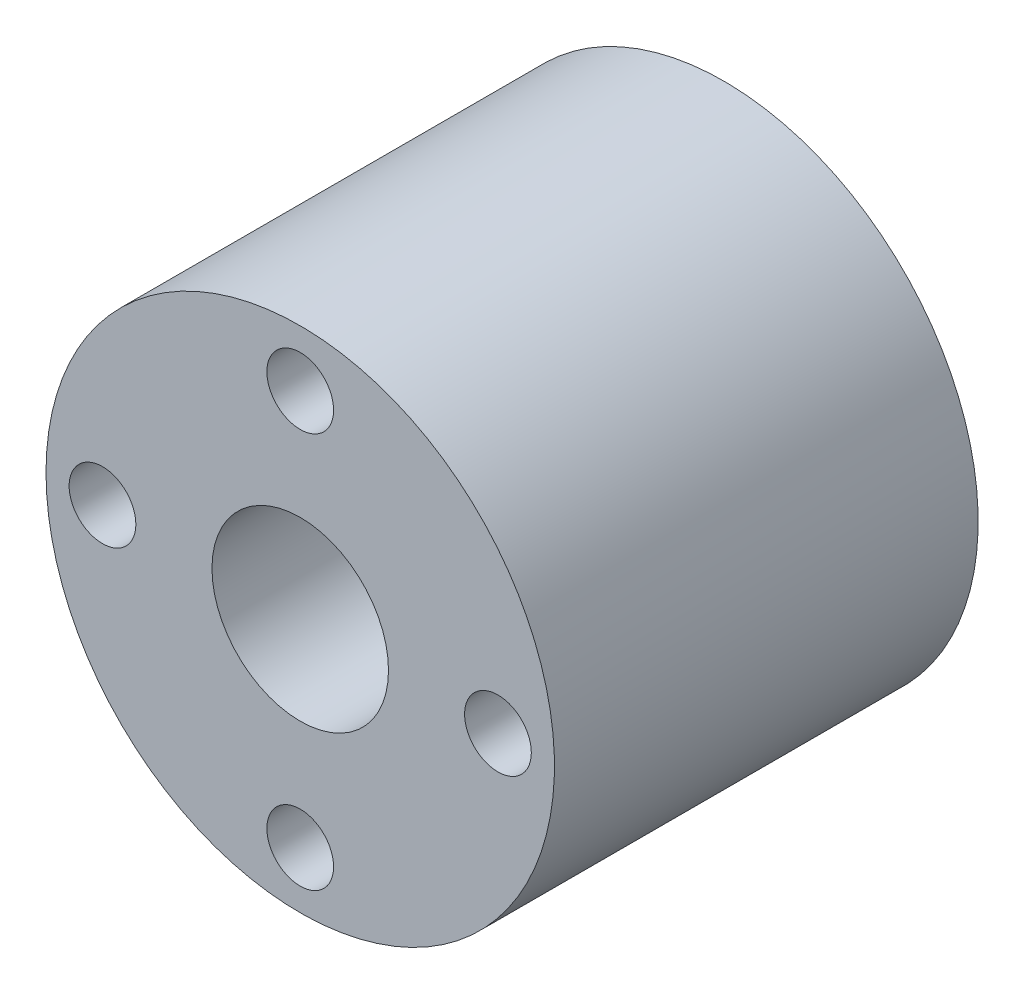
ISO-10303-21;
HEADER;
FILE_DESCRIPTION(('STEP AP214'),'2;1');
FILE_NAME('part.step','',(''),(''),'','','');
FILE_SCHEMA(('AUTOMOTIVE_DESIGN { 1 0 10303 214 1 1 1 1 }'));
ENDSEC;
DATA;
#1=APPLICATION_CONTEXT('core data for automotive mechanical design processes');
#2=APPLICATION_PROTOCOL_DEFINITION('international standard','automotive_design',2000,#1);
#3=PRODUCT_CONTEXT('',#1,'mechanical');
#4=PRODUCT('Part','Part','',(#3));
#5=PRODUCT_RELATED_PRODUCT_CATEGORY('part','',(#4));
#6=PRODUCT_DEFINITION_FORMATION('','',#4);
#7=PRODUCT_DEFINITION_CONTEXT('part definition',#1,'design');
#8=PRODUCT_DEFINITION('design','',#6,#7);
#9=PRODUCT_DEFINITION_SHAPE('','',#8);
#10=(LENGTH_UNIT() NAMED_UNIT(*) SI_UNIT(.MILLI.,.METRE.));
#11=(NAMED_UNIT(*) PLANE_ANGLE_UNIT() SI_UNIT($,.RADIAN.));
#12=(NAMED_UNIT(*) SI_UNIT($,.STERADIAN.) SOLID_ANGLE_UNIT());
#13=UNCERTAINTY_MEASURE_WITH_UNIT(LENGTH_MEASURE(1.E-05),#10,'distance_accuracy_value','');
#14=(GEOMETRIC_REPRESENTATION_CONTEXT(3) GLOBAL_UNCERTAINTY_ASSIGNED_CONTEXT((#13)) GLOBAL_UNIT_ASSIGNED_CONTEXT((#10,
#11,#12)) REPRESENTATION_CONTEXT('',''));
#15=CARTESIAN_POINT('',(0.,0.,0.));
#16=DIRECTION('',(0.,0.,1.));
#17=DIRECTION('',(1.,0.,0.));
#18=AXIS2_PLACEMENT_3D('',#15,#16,#17);
#19=CARTESIAN_POINT('',(0.,0.,19.05));
#20=DIRECTION('',(0.,0.,1.));
#21=DIRECTION('',(1.,0.,0.));
#22=AXIS2_PLACEMENT_3D('',#19,#20,#21);
#23=PLANE('',#22);
#24=CARTESIAN_POINT('',(8.89,0.,19.05));
#25=DIRECTION('',(0.,0.,1.));
#26=DIRECTION('',(1.,0.,0.));
#27=AXIS2_PLACEMENT_3D('',#24,#25,#26);
#28=CIRCLE('',#27,1.5);
#29=CARTESIAN_POINT('',(10.39,0.,19.05));
#30=VERTEX_POINT('',#29);
#31=EDGE_CURVE('E76',#30,#30,#28,.T.);
#32=ORIENTED_EDGE('',*,*,#31,.F.);
#33=EDGE_LOOP('',(#32));
#34=FACE_BOUND('',#33,.T.);
#35=CARTESIAN_POINT('',(0.,-8.89,19.05));
#36=DIRECTION('',(0.,0.,1.));
#37=DIRECTION('',(1.,0.,0.));
#38=AXIS2_PLACEMENT_3D('',#35,#36,#37);
#39=CIRCLE('',#38,1.5);
#40=CARTESIAN_POINT('',(1.5,-8.89,19.05));
#41=VERTEX_POINT('',#40);
#42=EDGE_CURVE('E70',#41,#41,#39,.T.);
#43=ORIENTED_EDGE('',*,*,#42,.F.);
#44=EDGE_LOOP('',(#43));
#45=FACE_BOUND('',#44,.T.);
#46=CARTESIAN_POINT('',(-8.89,0.,19.05));
#47=DIRECTION('',(0.,0.,1.));
#48=DIRECTION('',(1.,0.,0.));
#49=AXIS2_PLACEMENT_3D('',#46,#47,#48);
#50=CIRCLE('',#49,1.5);
#51=CARTESIAN_POINT('',(-7.39,0.,19.05));
#52=VERTEX_POINT('',#51);
#53=EDGE_CURVE('E64',#52,#52,#50,.T.);
#54=ORIENTED_EDGE('',*,*,#53,.F.);
#55=EDGE_LOOP('',(#54));
#56=FACE_BOUND('',#55,.T.);
#57=CARTESIAN_POINT('',(0.,8.89,19.05));
#58=DIRECTION('',(0.,0.,1.));
#59=DIRECTION('',(1.,0.,0.));
#60=AXIS2_PLACEMENT_3D('',#57,#58,#59);
#61=CIRCLE('',#60,1.5);
#62=CARTESIAN_POINT('',(1.5,8.89,19.05));
#63=VERTEX_POINT('',#62);
#64=EDGE_CURVE('E58',#63,#63,#61,.T.);
#65=ORIENTED_EDGE('',*,*,#64,.F.);
#66=EDGE_LOOP('',(#65));
#67=FACE_BOUND('',#66,.T.);
#68=CARTESIAN_POINT('',(0.,0.,19.05));
#69=DIRECTION('',(0.,0.,1.));
#70=DIRECTION('',(1.,0.,0.));
#71=AXIS2_PLACEMENT_3D('',#68,#69,#70);
#72=CIRCLE('',#71,11.43);
#73=CARTESIAN_POINT('',(-11.43,0.,19.05));
#74=VERTEX_POINT('',#73);
#75=EDGE_CURVE('E10',#74,#74,#72,.T.);
#76=ORIENTED_EDGE('',*,*,#75,.T.);
#77=EDGE_LOOP('',(#76));
#78=FACE_BOUND('',#77,.T.);
#79=CARTESIAN_POINT('',(0.,0.,19.05));
#80=DIRECTION('',(0.,0.,1.));
#81=DIRECTION('',(1.,0.,0.));
#82=AXIS2_PLACEMENT_3D('',#79,#80,#81);
#83=CIRCLE('',#82,3.96875);
#84=CARTESIAN_POINT('',(-3.96875,0.,19.05));
#85=VERTEX_POINT('',#84);
#86=EDGE_CURVE('E48',#85,#85,#83,.T.);
#87=ORIENTED_EDGE('',*,*,#86,.F.);
#88=EDGE_LOOP('',(#87));
#89=FACE_BOUND('',#88,.T.);
#90=ADVANCED_FACE('F37',(#34,#45,#56,#67,#78,#89),#23,.T.);
#91=CARTESIAN_POINT('',(0.,0.,0.));
#92=DIRECTION('',(0.,0.,1.));
#93=DIRECTION('',(1.,0.,0.));
#94=AXIS2_PLACEMENT_3D('',#91,#92,#93);
#95=PLANE('',#94);
#96=CARTESIAN_POINT('',(8.89,0.,0.));
#97=DIRECTION('',(0.,0.,1.));
#98=DIRECTION('',(1.,0.,0.));
#99=AXIS2_PLACEMENT_3D('',#96,#97,#98);
#100=CIRCLE('',#99,1.5);
#101=CARTESIAN_POINT('',(10.39,0.,0.));
#102=VERTEX_POINT('',#101);
#103=EDGE_CURVE('E73',#102,#102,#100,.T.);
#104=ORIENTED_EDGE('',*,*,#103,.T.);
#105=EDGE_LOOP('',(#104));
#106=FACE_BOUND('',#105,.T.);
#107=CARTESIAN_POINT('',(0.,-8.89,0.));
#108=DIRECTION('',(0.,0.,1.));
#109=DIRECTION('',(1.,0.,0.));
#110=AXIS2_PLACEMENT_3D('',#107,#108,#109);
#111=CIRCLE('',#110,1.5);
#112=CARTESIAN_POINT('',(1.5,-8.89,0.));
#113=VERTEX_POINT('',#112);
#114=EDGE_CURVE('E67',#113,#113,#111,.T.);
#115=ORIENTED_EDGE('',*,*,#114,.T.);
#116=EDGE_LOOP('',(#115));
#117=FACE_BOUND('',#116,.T.);
#118=CARTESIAN_POINT('',(-8.89,0.,0.));
#119=DIRECTION('',(0.,0.,1.));
#120=DIRECTION('',(1.,0.,0.));
#121=AXIS2_PLACEMENT_3D('',#118,#119,#120);
#122=CIRCLE('',#121,1.5);
#123=CARTESIAN_POINT('',(-7.39,0.,0.));
#124=VERTEX_POINT('',#123);
#125=EDGE_CURVE('E61',#124,#124,#122,.T.);
#126=ORIENTED_EDGE('',*,*,#125,.T.);
#127=EDGE_LOOP('',(#126));
#128=FACE_BOUND('',#127,.T.);
#129=CARTESIAN_POINT('',(0.,8.89,0.));
#130=DIRECTION('',(0.,0.,1.));
#131=DIRECTION('',(1.,0.,0.));
#132=AXIS2_PLACEMENT_3D('',#129,#130,#131);
#133=CIRCLE('',#132,1.5);
#134=CARTESIAN_POINT('',(1.5,8.89,0.));
#135=VERTEX_POINT('',#134);
#136=EDGE_CURVE('E53',#135,#135,#133,.T.);
#137=ORIENTED_EDGE('',*,*,#136,.T.);
#138=EDGE_LOOP('',(#137));
#139=FACE_BOUND('',#138,.T.);
#140=CARTESIAN_POINT('',(0.,0.,0.));
#141=DIRECTION('',(0.,0.,1.));
#142=DIRECTION('',(1.,0.,0.));
#143=AXIS2_PLACEMENT_3D('',#140,#141,#142);
#144=CIRCLE('',#143,11.43);
#145=CARTESIAN_POINT('',(-11.43,0.,0.));
#146=VERTEX_POINT('',#145);
#147=EDGE_CURVE('E41',#146,#146,#144,.T.);
#148=ORIENTED_EDGE('',*,*,#147,.F.);
#149=EDGE_LOOP('',(#148));
#150=FACE_BOUND('',#149,.T.);
#151=CARTESIAN_POINT('',(0.,0.,0.));
#152=DIRECTION('',(0.,0.,1.));
#153=DIRECTION('',(1.,0.,0.));
#154=AXIS2_PLACEMENT_3D('',#151,#152,#153);
#155=CIRCLE('',#154,3.96875);
#156=CARTESIAN_POINT('',(-3.96875,0.,0.));
#157=VERTEX_POINT('',#156);
#158=EDGE_CURVE('E50',#157,#157,#155,.T.);
#159=ORIENTED_EDGE('',*,*,#158,.T.);
#160=EDGE_LOOP('',(#159));
#161=FACE_BOUND('',#160,.T.);
#162=ADVANCED_FACE('F84',(#106,#117,#128,#139,#150,#161),#95,.F.);
#163=CARTESIAN_POINT('',(0.,0.,19.05));
#164=DIRECTION('',(0.,0.,-1.));
#165=DIRECTION('',(-1.,0.,0.));
#166=AXIS2_PLACEMENT_3D('',#163,#164,#165);
#167=CYLINDRICAL_SURFACE('',#166,11.43);
#168=CARTESIAN_POINT('',(-11.43,0.,19.05));
#169=CARTESIAN_POINT('',(-11.43,0.,18.8515625));
#170=CARTESIAN_POINT('',(-11.43,0.,18.653125));
#171=CARTESIAN_POINT('',(-11.43,0.,18.25625));
#172=CARTESIAN_POINT('',(-11.43,0.,18.0578125));
#173=CARTESIAN_POINT('',(-11.43,0.,17.6609375));
#174=CARTESIAN_POINT('',(-11.43,0.,17.4625));
#175=CARTESIAN_POINT('',(-11.43,0.,17.065625));
#176=CARTESIAN_POINT('',(-11.43,0.,16.8671875));
#177=CARTESIAN_POINT('',(-11.43,0.,16.4703125));
#178=CARTESIAN_POINT('',(-11.43,0.,16.271875));
#179=CARTESIAN_POINT('',(-11.43,0.,15.875));
#180=CARTESIAN_POINT('',(-11.43,0.,15.6765625));
#181=CARTESIAN_POINT('',(-11.43,0.,15.2796875));
#182=CARTESIAN_POINT('',(-11.43,0.,15.08125));
#183=CARTESIAN_POINT('',(-11.43,0.,14.684375));
#184=CARTESIAN_POINT('',(-11.43,0.,14.4859375));
#185=CARTESIAN_POINT('',(-11.43,0.,14.0890625));
#186=CARTESIAN_POINT('',(-11.43,0.,13.890625));
#187=CARTESIAN_POINT('',(-11.43,0.,13.49375));
#188=CARTESIAN_POINT('',(-11.43,0.,13.2953125));
#189=CARTESIAN_POINT('',(-11.43,0.,12.8984375));
#190=CARTESIAN_POINT('',(-11.43,0.,12.7));
#191=CARTESIAN_POINT('',(-11.43,0.,12.303125));
#192=CARTESIAN_POINT('',(-11.43,0.,12.1046875));
#193=CARTESIAN_POINT('',(-11.43,0.,11.7078125));
#194=CARTESIAN_POINT('',(-11.43,0.,11.509375));
#195=CARTESIAN_POINT('',(-11.43,0.,11.1125));
#196=CARTESIAN_POINT('',(-11.43,0.,10.9140625));
#197=CARTESIAN_POINT('',(-11.43,0.,10.5171875));
#198=CARTESIAN_POINT('',(-11.43,0.,10.31875));
#199=CARTESIAN_POINT('',(-11.43,0.,9.921875));
#200=CARTESIAN_POINT('',(-11.43,0.,9.7234375));
#201=CARTESIAN_POINT('',(-11.43,0.,9.3265625));
#202=CARTESIAN_POINT('',(-11.43,0.,9.128125));
#203=CARTESIAN_POINT('',(-11.43,0.,8.73125));
#204=CARTESIAN_POINT('',(-11.43,0.,8.5328125));
#205=CARTESIAN_POINT('',(-11.43,0.,8.1359375));
#206=CARTESIAN_POINT('',(-11.43,0.,7.9375));
#207=CARTESIAN_POINT('',(-11.43,0.,7.540625));
#208=CARTESIAN_POINT('',(-11.43,0.,7.3421875));
#209=CARTESIAN_POINT('',(-11.43,0.,6.9453125));
#210=CARTESIAN_POINT('',(-11.43,0.,6.746875));
#211=CARTESIAN_POINT('',(-11.43,0.,6.35));
#212=CARTESIAN_POINT('',(-11.43,0.,6.1515625));
#213=CARTESIAN_POINT('',(-11.43,0.,5.7546875));
#214=CARTESIAN_POINT('',(-11.43,0.,5.55625));
#215=CARTESIAN_POINT('',(-11.43,0.,5.159375));
#216=CARTESIAN_POINT('',(-11.43,0.,4.9609375));
#217=CARTESIAN_POINT('',(-11.43,0.,4.5640625));
#218=CARTESIAN_POINT('',(-11.43,0.,4.365625));
#219=CARTESIAN_POINT('',(-11.43,0.,3.96875));
#220=CARTESIAN_POINT('',(-11.43,0.,3.7703125));
#221=CARTESIAN_POINT('',(-11.43,0.,3.3734375));
#222=CARTESIAN_POINT('',(-11.43,0.,3.175));
#223=CARTESIAN_POINT('',(-11.43,0.,2.778125));
#224=CARTESIAN_POINT('',(-11.43,0.,2.5796875));
#225=CARTESIAN_POINT('',(-11.43,0.,2.1828125));
#226=CARTESIAN_POINT('',(-11.43,0.,1.984375));
#227=CARTESIAN_POINT('',(-11.43,0.,1.5875));
#228=CARTESIAN_POINT('',(-11.43,0.,1.3890625));
#229=CARTESIAN_POINT('',(-11.43,0.,0.992187500000001));
#230=CARTESIAN_POINT('',(-11.43,0.,0.793750000000001));
#231=CARTESIAN_POINT('',(-11.43,0.,0.396875));
#232=CARTESIAN_POINT('',(-11.43,0.,0.1984375));
#233=CARTESIAN_POINT('',(-11.43,0.,0.));
#234=B_SPLINE_CURVE_WITH_KNOTS('',3,(#168,#169,#170,#171,#172,#173,#174,#175,#176,#177,#178,
#179,#180,#181,#182,#183,#184,#185,#186,#187,#188,#189,#190,#191,#192,#193,#194,#195,#196,#197,
#198,#199,#200,#201,#202,#203,#204,#205,#206,#207,#208,#209,#210,#211,#212,#213,#214,#215,#216,
#217,#218,#219,#220,#221,#222,#223,#224,#225,#226,#227,#228,#229,#230,#231,#232,#233),
.UNSPECIFIED.,.F.,.F.,(4,2,2,2,2,2,2,2,2,2,2,2,2,2,2,2,2,2,2,2,2,2,2,2,2,2,2,2,2,2,2,2,4),(0.,
0.595312499999997,1.190625,1.7859375,2.38125,2.9765625,3.571875,4.1671875,4.7625,5.3578125,
5.953125,6.5484375,7.14375,7.7390625,8.334375,8.9296875,9.525,10.1203125,10.715625,11.3109375,
11.90625,12.5015625,13.096875,13.6921875,14.2875,14.8828125,15.478125,16.0734375,16.66875,
17.2640625,17.859375,18.4546875,19.05),.UNSPECIFIED.);
#235=EDGE_CURVE('BSEAM39',#74,#146,#234,.T.);
#236=ORIENTED_EDGE('',*,*,#75,.F.);
#237=ORIENTED_EDGE('',*,*,#147,.T.);
#238=ORIENTED_EDGE('',*,*,#235,.T.);
#239=ORIENTED_EDGE('',*,*,#235,.F.);
#240=EDGE_LOOP('',(#236,#238,#237,#239));
#241=FACE_BOUND('',#240,.T.);
#242=ADVANCED_FACE('F39',(#241),#167,.T.);
#243=CARTESIAN_POINT('',(0.,0.,19.05));
#244=DIRECTION('',(0.,0.,-1.));
#245=DIRECTION('',(-1.,0.,0.));
#246=AXIS2_PLACEMENT_3D('',#243,#244,#245);
#247=CYLINDRICAL_SURFACE('',#246,3.96875);
#248=CARTESIAN_POINT('',(-3.96875,0.,19.05));
#249=CARTESIAN_POINT('',(-3.96875,0.,18.8515625));
#250=CARTESIAN_POINT('',(-3.96875,0.,18.653125));
#251=CARTESIAN_POINT('',(-3.96875,0.,18.25625));
#252=CARTESIAN_POINT('',(-3.96875,0.,18.0578125));
#253=CARTESIAN_POINT('',(-3.96875,0.,17.6609375));
#254=CARTESIAN_POINT('',(-3.96875,0.,17.4625));
#255=CARTESIAN_POINT('',(-3.96875,0.,17.065625));
#256=CARTESIAN_POINT('',(-3.96875,0.,16.8671875));
#257=CARTESIAN_POINT('',(-3.96875,0.,16.4703125));
#258=CARTESIAN_POINT('',(-3.96875,0.,16.271875));
#259=CARTESIAN_POINT('',(-3.96875,0.,15.875));
#260=CARTESIAN_POINT('',(-3.96875,0.,15.6765625));
#261=CARTESIAN_POINT('',(-3.96875,0.,15.2796875));
#262=CARTESIAN_POINT('',(-3.96875,0.,15.08125));
#263=CARTESIAN_POINT('',(-3.96875,0.,14.684375));
#264=CARTESIAN_POINT('',(-3.96875,0.,14.4859375));
#265=CARTESIAN_POINT('',(-3.96875,0.,14.0890625));
#266=CARTESIAN_POINT('',(-3.96875,0.,13.890625));
#267=CARTESIAN_POINT('',(-3.96875,0.,13.49375));
#268=CARTESIAN_POINT('',(-3.96875,0.,13.2953125));
#269=CARTESIAN_POINT('',(-3.96875,0.,12.8984375));
#270=CARTESIAN_POINT('',(-3.96875,0.,12.7));
#271=CARTESIAN_POINT('',(-3.96875,0.,12.303125));
#272=CARTESIAN_POINT('',(-3.96875,0.,12.1046875));
#273=CARTESIAN_POINT('',(-3.96875,0.,11.7078125));
#274=CARTESIAN_POINT('',(-3.96875,0.,11.509375));
#275=CARTESIAN_POINT('',(-3.96875,0.,11.1125));
#276=CARTESIAN_POINT('',(-3.96875,0.,10.9140625));
#277=CARTESIAN_POINT('',(-3.96875,0.,10.5171875));
#278=CARTESIAN_POINT('',(-3.96875,0.,10.31875));
#279=CARTESIAN_POINT('',(-3.96875,0.,9.921875));
#280=CARTESIAN_POINT('',(-3.96875,0.,9.7234375));
#281=CARTESIAN_POINT('',(-3.96875,0.,9.3265625));
#282=CARTESIAN_POINT('',(-3.96875,0.,9.128125));
#283=CARTESIAN_POINT('',(-3.96875,0.,8.73125));
#284=CARTESIAN_POINT('',(-3.96875,0.,8.5328125));
#285=CARTESIAN_POINT('',(-3.96875,0.,8.1359375));
#286=CARTESIAN_POINT('',(-3.96875,0.,7.9375));
#287=CARTESIAN_POINT('',(-3.96875,0.,7.540625));
#288=CARTESIAN_POINT('',(-3.96875,0.,7.3421875));
#289=CARTESIAN_POINT('',(-3.96875,0.,6.9453125));
#290=CARTESIAN_POINT('',(-3.96875,0.,6.746875));
#291=CARTESIAN_POINT('',(-3.96875,0.,6.35));
#292=CARTESIAN_POINT('',(-3.96875,0.,6.1515625));
#293=CARTESIAN_POINT('',(-3.96875,0.,5.7546875));
#294=CARTESIAN_POINT('',(-3.96875,0.,5.55625));
#295=CARTESIAN_POINT('',(-3.96875,0.,5.159375));
#296=CARTESIAN_POINT('',(-3.96875,0.,4.9609375));
#297=CARTESIAN_POINT('',(-3.96875,0.,4.5640625));
#298=CARTESIAN_POINT('',(-3.96875,0.,4.365625));
#299=CARTESIAN_POINT('',(-3.96875,0.,3.96875));
#300=CARTESIAN_POINT('',(-3.96875,0.,3.7703125));
#301=CARTESIAN_POINT('',(-3.96875,0.,3.3734375));
#302=CARTESIAN_POINT('',(-3.96875,0.,3.175));
#303=CARTESIAN_POINT('',(-3.96875,0.,2.778125));
#304=CARTESIAN_POINT('',(-3.96875,0.,2.5796875));
#305=CARTESIAN_POINT('',(-3.96875,0.,2.1828125));
#306=CARTESIAN_POINT('',(-3.96875,0.,1.984375));
#307=CARTESIAN_POINT('',(-3.96875,0.,1.5875));
#308=CARTESIAN_POINT('',(-3.96875,0.,1.3890625));
#309=CARTESIAN_POINT('',(-3.96875,0.,0.992187500000001));
#310=CARTESIAN_POINT('',(-3.96875,0.,0.793750000000001));
#311=CARTESIAN_POINT('',(-3.96875,0.,0.396875));
#312=CARTESIAN_POINT('',(-3.96875,0.,0.1984375));
#313=CARTESIAN_POINT('',(-3.96875,0.,0.));
#314=B_SPLINE_CURVE_WITH_KNOTS('',3,(#248,#249,#250,#251,#252,#253,#254,#255,#256,#257,#258,
#259,#260,#261,#262,#263,#264,#265,#266,#267,#268,#269,#270,#271,#272,#273,#274,#275,#276,#277,
#278,#279,#280,#281,#282,#283,#284,#285,#286,#287,#288,#289,#290,#291,#292,#293,#294,#295,#296,
#297,#298,#299,#300,#301,#302,#303,#304,#305,#306,#307,#308,#309,#310,#311,#312,#313),
.UNSPECIFIED.,.F.,.F.,(4,2,2,2,2,2,2,2,2,2,2,2,2,2,2,2,2,2,2,2,2,2,2,2,2,2,2,2,2,2,2,2,4),(0.,
0.5953125,1.190625,1.7859375,2.38125,2.9765625,3.571875,4.1671875,4.7625,5.3578125,5.953125,
6.5484375,7.14375,7.7390625,8.334375,8.9296875,9.525,10.1203125,10.715625,11.3109375,11.90625,
12.5015625,13.096875,13.6921875,14.2875,14.8828125,15.478125,16.0734375,16.66875,17.2640625,
17.859375,18.4546875,19.05),.UNSPECIFIED.);
#315=EDGE_CURVE('BSEAM94',#85,#157,#314,.T.);
#316=ORIENTED_EDGE('',*,*,#86,.T.);
#317=ORIENTED_EDGE('',*,*,#158,.F.);
#318=ORIENTED_EDGE('',*,*,#315,.T.);
#319=ORIENTED_EDGE('',*,*,#315,.F.);
#320=EDGE_LOOP('',(#316,#318,#317,#319));
#321=FACE_BOUND('',#320,.T.);
#322=ADVANCED_FACE('F94',(#321),#247,.F.);
#323=CARTESIAN_POINT('',(0.,8.89,19.05));
#324=DIRECTION('',(0.,0.,1.));
#325=DIRECTION('',(1.,0.,0.));
#326=AXIS2_PLACEMENT_3D('',#323,#324,#325);
#327=CYLINDRICAL_SURFACE('',#326,1.5);
#328=ORIENTED_EDGE('',*,*,#136,.F.);
#329=EDGE_LOOP('',(#328));
#330=FACE_BOUND('',#329,.T.);
#331=ORIENTED_EDGE('',*,*,#64,.T.);
#332=EDGE_LOOP('',(#331));
#333=FACE_BOUND('',#332,.T.);
#334=ADVANCED_FACE('F97',(#330,#333),#327,.F.);
#335=CARTESIAN_POINT('',(-8.89,0.,19.05));
#336=DIRECTION('',(0.,0.,1.));
#337=DIRECTION('',(1.,0.,0.));
#338=AXIS2_PLACEMENT_3D('',#335,#336,#337);
#339=CYLINDRICAL_SURFACE('',#338,1.5);
#340=ORIENTED_EDGE('',*,*,#125,.F.);
#341=EDGE_LOOP('',(#340));
#342=FACE_BOUND('',#341,.T.);
#343=ORIENTED_EDGE('',*,*,#53,.T.);
#344=EDGE_LOOP('',(#343));
#345=FACE_BOUND('',#344,.T.);
#346=ADVANCED_FACE('F112',(#342,#345),#339,.F.);
#347=CARTESIAN_POINT('',(0.,-8.89,19.05));
#348=DIRECTION('',(0.,0.,1.));
#349=DIRECTION('',(1.,0.,0.));
#350=AXIS2_PLACEMENT_3D('',#347,#348,#349);
#351=CYLINDRICAL_SURFACE('',#350,1.5);
#352=ORIENTED_EDGE('',*,*,#114,.F.);
#353=EDGE_LOOP('',(#352));
#354=FACE_BOUND('',#353,.T.);
#355=ORIENTED_EDGE('',*,*,#42,.T.);
#356=EDGE_LOOP('',(#355));
#357=FACE_BOUND('',#356,.T.);
#358=ADVANCED_FACE('F115',(#354,#357),#351,.F.);
#359=CARTESIAN_POINT('',(8.89,0.,19.05));
#360=DIRECTION('',(0.,0.,1.));
#361=DIRECTION('',(1.,0.,0.));
#362=AXIS2_PLACEMENT_3D('',#359,#360,#361);
#363=CYLINDRICAL_SURFACE('',#362,1.5);
#364=ORIENTED_EDGE('',*,*,#103,.F.);
#365=EDGE_LOOP('',(#364));
#366=FACE_BOUND('',#365,.T.);
#367=ORIENTED_EDGE('',*,*,#31,.T.);
#368=EDGE_LOOP('',(#367));
#369=FACE_BOUND('',#368,.T.);
#370=ADVANCED_FACE('F80',(#366,#369),#363,.F.);
#371=CLOSED_SHELL('',(#90,#162,#242,#322,#334,#346,#358,#370));
#372=MANIFOLD_SOLID_BREP('B2',#371);
#373=ADVANCED_BREP_SHAPE_REPRESENTATION('',(#18,#372),#14);
#374=SHAPE_DEFINITION_REPRESENTATION(#9,#373);
ENDSEC;
END-ISO-10303-21;
